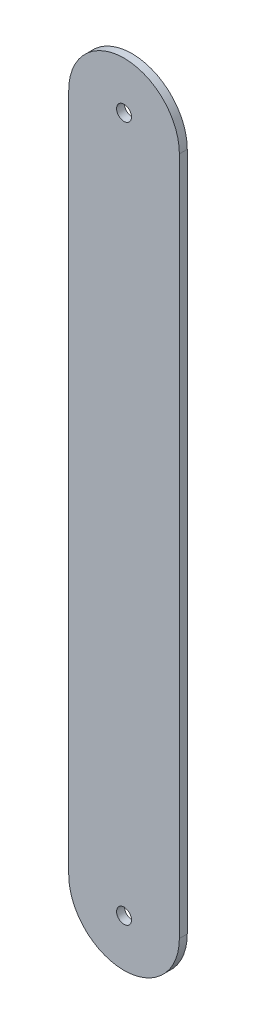
ISO-10303-21;
HEADER;
FILE_DESCRIPTION(('STEP AP214'),'2;1');
FILE_NAME('part.step','',(''),(''),'','','');
FILE_SCHEMA(('AUTOMOTIVE_DESIGN { 1 0 10303 214 1 1 1 1 }'));
ENDSEC;
DATA;
#1=APPLICATION_CONTEXT('core data for automotive mechanical design processes');
#2=APPLICATION_PROTOCOL_DEFINITION('international standard','automotive_design',2000,#1);
#3=PRODUCT_CONTEXT('',#1,'mechanical');
#4=PRODUCT('Part','Part','',(#3));
#5=PRODUCT_RELATED_PRODUCT_CATEGORY('part','',(#4));
#6=PRODUCT_DEFINITION_FORMATION('','',#4);
#7=PRODUCT_DEFINITION_CONTEXT('part definition',#1,'design');
#8=PRODUCT_DEFINITION('design','',#6,#7);
#9=PRODUCT_DEFINITION_SHAPE('','',#8);
#10=(LENGTH_UNIT() NAMED_UNIT(*) SI_UNIT(.MILLI.,.METRE.));
#11=(NAMED_UNIT(*) PLANE_ANGLE_UNIT() SI_UNIT($,.RADIAN.));
#12=(NAMED_UNIT(*) SI_UNIT($,.STERADIAN.) SOLID_ANGLE_UNIT());
#13=UNCERTAINTY_MEASURE_WITH_UNIT(LENGTH_MEASURE(1.E-05),#10,'distance_accuracy_value','');
#14=(GEOMETRIC_REPRESENTATION_CONTEXT(3) GLOBAL_UNCERTAINTY_ASSIGNED_CONTEXT((#13)) GLOBAL_UNIT_ASSIGNED_CONTEXT((#10,
#11,#12)) REPRESENTATION_CONTEXT('',''));
#15=CARTESIAN_POINT('',(0.,0.,0.));
#16=DIRECTION('',(0.,0.,1.));
#17=DIRECTION('',(1.,0.,0.));
#18=AXIS2_PLACEMENT_3D('',#15,#16,#17);
#19=CARTESIAN_POINT('',(0.,-68.2625,1.5875));
#20=DIRECTION('',(0.,0.,-1.));
#21=DIRECTION('',(-1.,0.,0.));
#22=AXIS2_PLACEMENT_3D('',#19,#20,#21);
#23=CYLINDRICAL_SURFACE('',#22,11.1125);
#24=CARTESIAN_POINT('',(0.,-68.2625,0.));
#25=DIRECTION('',(0.,0.,1.));
#26=DIRECTION('',(1.,0.,0.));
#27=AXIS2_PLACEMENT_3D('',#24,#25,#26);
#28=CIRCLE('',#27,11.1125);
#29=CARTESIAN_POINT('',(-11.1125,-68.2625,0.));
#30=VERTEX_POINT('',#29);
#31=CARTESIAN_POINT('',(11.1125,-68.2625,0.));
#32=VERTEX_POINT('',#31);
#33=EDGE_CURVE('E104',#30,#32,#28,.T.);
#34=ORIENTED_EDGE('',*,*,#33,.T.);
#35=DIRECTION('',(0.,0.,-1.));
#36=VECTOR('',#35,1.);
#37=CARTESIAN_POINT('',(11.1125,-68.2625,1.5875));
#38=LINE('',#37,#36);
#39=CARTESIAN_POINT('',(11.1125,-68.2625,1.5875));
#40=VERTEX_POINT('',#39);
#41=EDGE_CURVE('E11',#40,#32,#38,.T.);
#42=ORIENTED_EDGE('',*,*,#41,.F.);
#43=CARTESIAN_POINT('',(0.,-68.2625,1.5875));
#44=DIRECTION('',(0.,0.,1.));
#45=DIRECTION('',(1.,0.,0.));
#46=AXIS2_PLACEMENT_3D('',#43,#44,#45);
#47=CIRCLE('',#46,11.1125);
#48=CARTESIAN_POINT('',(-11.1125,-68.2625,1.5875));
#49=VERTEX_POINT('',#48);
#50=EDGE_CURVE('E74',#49,#40,#47,.T.);
#51=ORIENTED_EDGE('',*,*,#50,.F.);
#52=DIRECTION('',(0.,0.,-1.));
#53=VECTOR('',#52,1.);
#54=CARTESIAN_POINT('',(-11.1125,-68.2625,1.5875));
#55=LINE('',#54,#53);
#56=EDGE_CURVE('E103',#49,#30,#55,.T.);
#57=ORIENTED_EDGE('',*,*,#56,.T.);
#58=EDGE_LOOP('',(#34,#42,#51,#57));
#59=FACE_BOUND('',#58,.T.);
#60=ADVANCED_FACE('F35',(#59),#23,.T.);
#61=CARTESIAN_POINT('',(11.1125,0.,1.5875));
#62=DIRECTION('',(1.,0.,0.));
#63=DIRECTION('',(0.,0.,-1.));
#64=AXIS2_PLACEMENT_3D('',#61,#62,#63);
#65=PLANE('',#64);
#66=DIRECTION('',(0.,-1.,0.));
#67=VECTOR('',#66,1.);
#68=CARTESIAN_POINT('',(11.1125,0.,0.));
#69=LINE('',#68,#67);
#70=CARTESIAN_POINT('',(11.1125,68.2625,0.));
#71=VERTEX_POINT('',#70);
#72=EDGE_CURVE('E83',#71,#32,#69,.T.);
#73=ORIENTED_EDGE('',*,*,#72,.F.);
#74=DIRECTION('',(0.,0.,-1.));
#75=VECTOR('',#74,1.);
#76=CARTESIAN_POINT('',(11.1125,68.2625,1.5875));
#77=LINE('',#76,#75);
#78=CARTESIAN_POINT('',(11.1125,68.2625,1.5875));
#79=VERTEX_POINT('',#78);
#80=EDGE_CURVE('E43',#79,#71,#77,.T.);
#81=ORIENTED_EDGE('',*,*,#80,.F.);
#82=DIRECTION('',(0.,-1.,0.));
#83=VECTOR('',#82,1.);
#84=CARTESIAN_POINT('',(11.1125,0.,1.5875));
#85=LINE('',#84,#83);
#86=EDGE_CURVE('E81',#79,#40,#85,.T.);
#87=ORIENTED_EDGE('',*,*,#86,.T.);
#88=ORIENTED_EDGE('',*,*,#41,.T.);
#89=EDGE_LOOP('',(#73,#81,#87,#88));
#90=FACE_BOUND('',#89,.T.);
#91=ADVANCED_FACE('F80',(#90),#65,.T.);
#92=CARTESIAN_POINT('',(0.,68.2625,1.5875));
#93=DIRECTION('',(0.,0.,-1.));
#94=DIRECTION('',(-1.,0.,0.));
#95=AXIS2_PLACEMENT_3D('',#92,#93,#94);
#96=CYLINDRICAL_SURFACE('',#95,11.1125);
#97=CARTESIAN_POINT('',(0.,68.2625,0.));
#98=DIRECTION('',(0.,0.,1.));
#99=DIRECTION('',(1.,0.,0.));
#100=AXIS2_PLACEMENT_3D('',#97,#98,#99);
#101=CIRCLE('',#100,11.1125);
#102=CARTESIAN_POINT('',(-11.1125,68.2625,0.));
#103=VERTEX_POINT('',#102);
#104=EDGE_CURVE('E108',#103,#71,#101,.F.);
#105=ORIENTED_EDGE('',*,*,#104,.F.);
#106=DIRECTION('',(0.,0.,-1.));
#107=VECTOR('',#106,1.);
#108=CARTESIAN_POINT('',(-11.1125,68.2625,1.5875));
#109=LINE('',#108,#107);
#110=CARTESIAN_POINT('',(-11.1125,68.2625,1.5875));
#111=VERTEX_POINT('',#110);
#112=EDGE_CURVE('E66',#111,#103,#109,.T.);
#113=ORIENTED_EDGE('',*,*,#112,.F.);
#114=CARTESIAN_POINT('',(0.,68.2625,1.5875));
#115=DIRECTION('',(0.,0.,1.));
#116=DIRECTION('',(1.,0.,0.));
#117=AXIS2_PLACEMENT_3D('',#114,#115,#116);
#118=CIRCLE('',#117,11.1125);
#119=EDGE_CURVE('E90',#111,#79,#118,.F.);
#120=ORIENTED_EDGE('',*,*,#119,.T.);
#121=ORIENTED_EDGE('',*,*,#80,.T.);
#122=EDGE_LOOP('',(#105,#113,#120,#121));
#123=FACE_BOUND('',#122,.T.);
#124=ADVANCED_FACE('F92',(#123),#96,.T.);
#125=CARTESIAN_POINT('',(0.,69.85,1.5875));
#126=DIRECTION('',(0.,0.,-1.));
#127=DIRECTION('',(-1.,0.,0.));
#128=AXIS2_PLACEMENT_3D('',#125,#126,#127);
#129=CYLINDRICAL_SURFACE('',#128,1.5);
#130=CARTESIAN_POINT('',(0.,69.85,1.5875));
#131=DIRECTION('',(0.,0.,1.));
#132=DIRECTION('',(1.,0.,0.));
#133=AXIS2_PLACEMENT_3D('',#130,#131,#132);
#134=CIRCLE('',#133,1.5);
#135=CARTESIAN_POINT('',(1.50000000000002,69.85,1.5875));
#136=VERTEX_POINT('',#135);
#137=EDGE_CURVE('E94',#136,#136,#134,.T.);
#138=ORIENTED_EDGE('',*,*,#137,.T.);
#139=EDGE_LOOP('',(#138));
#140=FACE_BOUND('',#139,.T.);
#141=CARTESIAN_POINT('',(0.,69.85,0.));
#142=DIRECTION('',(0.,0.,1.));
#143=DIRECTION('',(1.,0.,0.));
#144=AXIS2_PLACEMENT_3D('',#141,#142,#143);
#145=CIRCLE('',#144,1.5);
#146=CARTESIAN_POINT('',(1.50000000000002,69.85,0.));
#147=VERTEX_POINT('',#146);
#148=EDGE_CURVE('E111',#147,#147,#145,.T.);
#149=ORIENTED_EDGE('',*,*,#148,.F.);
#150=EDGE_LOOP('',(#149));
#151=FACE_BOUND('',#150,.T.);
#152=ADVANCED_FACE('F139',(#140,#151),#129,.F.);
#153=CARTESIAN_POINT('',(-11.1125,0.,1.5875));
#154=DIRECTION('',(1.,0.,0.));
#155=DIRECTION('',(0.,0.,-1.));
#156=AXIS2_PLACEMENT_3D('',#153,#154,#155);
#157=PLANE('',#156);
#158=DIRECTION('',(0.,-1.,0.));
#159=VECTOR('',#158,1.);
#160=CARTESIAN_POINT('',(-11.1125,0.,0.));
#161=LINE('',#160,#159);
#162=EDGE_CURVE('E69',#103,#30,#161,.T.);
#163=ORIENTED_EDGE('',*,*,#162,.T.);
#164=ORIENTED_EDGE('',*,*,#56,.F.);
#165=DIRECTION('',(0.,-1.,0.));
#166=VECTOR('',#165,1.);
#167=CARTESIAN_POINT('',(-11.1125,0.,1.5875));
#168=LINE('',#167,#166);
#169=EDGE_CURVE('E51',#111,#49,#168,.T.);
#170=ORIENTED_EDGE('',*,*,#169,.F.);
#171=ORIENTED_EDGE('',*,*,#112,.T.);
#172=EDGE_LOOP('',(#163,#164,#170,#171));
#173=FACE_BOUND('',#172,.T.);
#174=ADVANCED_FACE('F131',(#173),#157,.F.);
#175=CARTESIAN_POINT('',(0.,-69.85,1.5875));
#176=DIRECTION('',(0.,0.,-1.));
#177=DIRECTION('',(-1.,0.,0.));
#178=AXIS2_PLACEMENT_3D('',#175,#176,#177);
#179=CYLINDRICAL_SURFACE('',#178,1.5);
#180=CARTESIAN_POINT('',(0.,-69.85,1.5875));
#181=DIRECTION('',(0.,0.,1.));
#182=DIRECTION('',(1.,0.,0.));
#183=AXIS2_PLACEMENT_3D('',#180,#181,#182);
#184=CIRCLE('',#183,1.5);
#185=CARTESIAN_POINT('',(1.49999999999999,-69.85,1.5875));
#186=VERTEX_POINT('',#185);
#187=EDGE_CURVE('E100',#186,#186,#184,.T.);
#188=ORIENTED_EDGE('',*,*,#187,.T.);
#189=EDGE_LOOP('',(#188));
#190=FACE_BOUND('',#189,.T.);
#191=CARTESIAN_POINT('',(0.,-69.85,0.));
#192=DIRECTION('',(0.,0.,1.));
#193=DIRECTION('',(1.,0.,0.));
#194=AXIS2_PLACEMENT_3D('',#191,#192,#193);
#195=CIRCLE('',#194,1.5);
#196=CARTESIAN_POINT('',(1.49999999999999,-69.85,0.));
#197=VERTEX_POINT('',#196);
#198=EDGE_CURVE('E114',#197,#197,#195,.T.);
#199=ORIENTED_EDGE('',*,*,#198,.F.);
#200=EDGE_LOOP('',(#199));
#201=FACE_BOUND('',#200,.T.);
#202=ADVANCED_FACE('F129',(#190,#201),#179,.F.);
#203=CARTESIAN_POINT('',(0.,0.,1.5875));
#204=DIRECTION('',(0.,0.,1.));
#205=DIRECTION('',(1.,0.,0.));
#206=AXIS2_PLACEMENT_3D('',#203,#204,#205);
#207=PLANE('',#206);
#208=ORIENTED_EDGE('',*,*,#50,.T.);
#209=ORIENTED_EDGE('',*,*,#86,.F.);
#210=ORIENTED_EDGE('',*,*,#119,.F.);
#211=ORIENTED_EDGE('',*,*,#169,.T.);
#212=EDGE_LOOP('',(#208,#209,#210,#211));
#213=FACE_BOUND('',#212,.T.);
#214=ORIENTED_EDGE('',*,*,#137,.F.);
#215=EDGE_LOOP('',(#214));
#216=FACE_BOUND('',#215,.T.);
#217=ORIENTED_EDGE('',*,*,#187,.F.);
#218=EDGE_LOOP('',(#217));
#219=FACE_BOUND('',#218,.T.);
#220=ADVANCED_FACE('F88',(#213,#216,#219),#207,.T.);
#221=CARTESIAN_POINT('',(0.,0.,0.));
#222=DIRECTION('',(0.,0.,1.));
#223=DIRECTION('',(1.,0.,0.));
#224=AXIS2_PLACEMENT_3D('',#221,#222,#223);
#225=PLANE('',#224);
#226=ORIENTED_EDGE('',*,*,#33,.F.);
#227=ORIENTED_EDGE('',*,*,#162,.F.);
#228=ORIENTED_EDGE('',*,*,#104,.T.);
#229=ORIENTED_EDGE('',*,*,#72,.T.);
#230=EDGE_LOOP('',(#226,#227,#228,#229));
#231=FACE_BOUND('',#230,.T.);
#232=ORIENTED_EDGE('',*,*,#148,.T.);
#233=EDGE_LOOP('',(#232));
#234=FACE_BOUND('',#233,.T.);
#235=ORIENTED_EDGE('',*,*,#198,.T.);
#236=EDGE_LOOP('',(#235));
#237=FACE_BOUND('',#236,.T.);
#238=ADVANCED_FACE('F121',(#231,#234,#237),#225,.F.);
#239=CLOSED_SHELL('',(#60,#91,#124,#152,#174,#202,#220,#238));
#240=MANIFOLD_SOLID_BREP('B2',#239);
#241=ADVANCED_BREP_SHAPE_REPRESENTATION('',(#18,#240),#14);
#242=SHAPE_DEFINITION_REPRESENTATION(#9,#241);
ENDSEC;
END-ISO-10303-21;
